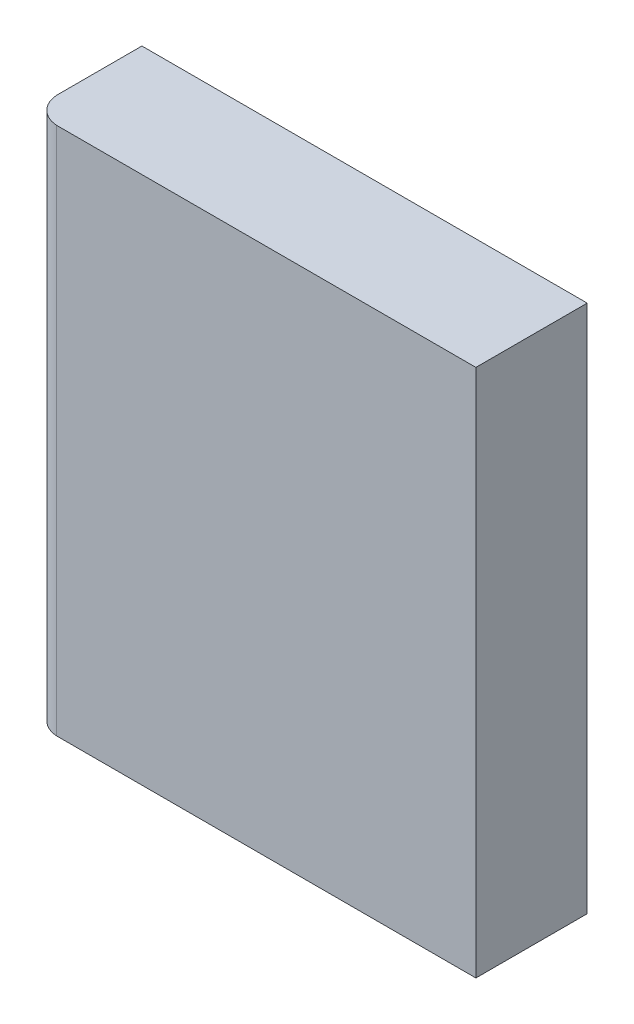
ISO-10303-21;
HEADER;
FILE_DESCRIPTION(('STEP AP214'),'2;1');
FILE_NAME('part.step','',(''),(''),'','','');
FILE_SCHEMA(('AUTOMOTIVE_DESIGN { 1 0 10303 214 1 1 1 1 }'));
ENDSEC;
DATA;
#1=APPLICATION_CONTEXT('core data for automotive mechanical design processes');
#2=APPLICATION_PROTOCOL_DEFINITION('international standard','automotive_design',2000,#1);
#3=PRODUCT_CONTEXT('',#1,'mechanical');
#4=PRODUCT('Part','Part','',(#3));
#5=PRODUCT_RELATED_PRODUCT_CATEGORY('part','',(#4));
#6=PRODUCT_DEFINITION_FORMATION('','',#4);
#7=PRODUCT_DEFINITION_CONTEXT('part definition',#1,'design');
#8=PRODUCT_DEFINITION('design','',#6,#7);
#9=PRODUCT_DEFINITION_SHAPE('','',#8);
#10=(LENGTH_UNIT() NAMED_UNIT(*) SI_UNIT(.MILLI.,.METRE.));
#11=(NAMED_UNIT(*) PLANE_ANGLE_UNIT() SI_UNIT($,.RADIAN.));
#12=(NAMED_UNIT(*) SI_UNIT($,.STERADIAN.) SOLID_ANGLE_UNIT());
#13=UNCERTAINTY_MEASURE_WITH_UNIT(LENGTH_MEASURE(1.E-05),#10,'distance_accuracy_value','');
#14=(GEOMETRIC_REPRESENTATION_CONTEXT(3) GLOBAL_UNCERTAINTY_ASSIGNED_CONTEXT((#13)) GLOBAL_UNIT_ASSIGNED_CONTEXT((#10,
#11,#12)) REPRESENTATION_CONTEXT('',''));
#15=CARTESIAN_POINT('',(0.,0.,0.));
#16=DIRECTION('',(0.,0.,1.));
#17=DIRECTION('',(1.,0.,0.));
#18=AXIS2_PLACEMENT_3D('',#15,#16,#17);
#19=CARTESIAN_POINT('',(-12.7633232342914,30.1625,-2.9228113537551));
#20=DIRECTION('',(1.,0.,0.));
#21=DIRECTION('',(0.,0.,-1.));
#22=AXIS2_PLACEMENT_3D('',#19,#20,#21);
#23=PLANE('',#22);
#24=DIRECTION('',(0.,0.,1.));
#25=VECTOR('',#24,1.);
#26=CARTESIAN_POINT('',(-12.7633232342914,0.,-2.9228113537551));
#27=LINE('',#26,#25);
#28=CARTESIAN_POINT('',(-12.7633232342914,0.,-2.9228113537551));
#29=VERTEX_POINT('',#28);
#30=CARTESIAN_POINT('',(-12.7633232342914,0.,1.92838620796249));
#31=VERTEX_POINT('',#30);
#32=EDGE_CURVE('E109',#29,#31,#27,.T.);
#33=ORIENTED_EDGE('',*,*,#32,.T.);
#34=DIRECTION('',(0.,-1.,0.));
#35=VECTOR('',#34,1.);
#36=CARTESIAN_POINT('',(-12.7633232342914,30.1625,1.92838620796249));
#37=LINE('',#36,#35);
#38=CARTESIAN_POINT('',(-12.7633232342914,30.1625,1.92838620796249));
#39=VERTEX_POINT('',#38);
#40=EDGE_CURVE('E11',#39,#31,#37,.T.);
#41=ORIENTED_EDGE('',*,*,#40,.F.);
#42=DIRECTION('',(0.,0.,1.));
#43=VECTOR('',#42,1.);
#44=CARTESIAN_POINT('',(-12.7633232342914,30.1625,-2.9228113537551));
#45=LINE('',#44,#43);
#46=CARTESIAN_POINT('',(-12.7633232342914,30.1625,-2.9228113537551));
#47=VERTEX_POINT('',#46);
#48=EDGE_CURVE('E117',#47,#39,#45,.T.);
#49=ORIENTED_EDGE('',*,*,#48,.F.);
#50=DIRECTION('',(0.,-1.,0.));
#51=VECTOR('',#50,1.);
#52=CARTESIAN_POINT('',(-12.7633232342914,30.1625,-2.9228113537551));
#53=LINE('',#52,#51);
#54=EDGE_CURVE('E105',#47,#29,#53,.T.);
#55=ORIENTED_EDGE('',*,*,#54,.T.);
#56=EDGE_LOOP('',(#33,#41,#49,#55));
#57=FACE_BOUND('',#56,.T.);
#58=ADVANCED_FACE('F35',(#57),#23,.F.);
#59=CARTESIAN_POINT('',(-11.1781219985274,30.1625,1.84298543435758));
#60=DIRECTION('',(0.,-1.,0.));
#61=DIRECTION('',(0.,0.,-1.));
#62=AXIS2_PLACEMENT_3D('',#59,#60,#61);
#63=CYLINDRICAL_SURFACE('',#62,1.5875);
#64=CARTESIAN_POINT('',(-11.1781219985274,0.,1.84298543435758));
#65=DIRECTION('',(0.,1.,0.));
#66=DIRECTION('',(0.,0.,1.));
#67=AXIS2_PLACEMENT_3D('',#64,#65,#66);
#68=CIRCLE('',#67,1.5875);
#69=CARTESIAN_POINT('',(-11.2803787021996,0.,3.4271886462449));
#70=VERTEX_POINT('',#69);
#71=EDGE_CURVE('E112',#31,#70,#68,.T.);
#72=ORIENTED_EDGE('',*,*,#71,.T.);
#73=DIRECTION('',(0.,-1.,0.));
#74=VECTOR('',#73,1.);
#75=CARTESIAN_POINT('',(-11.2803787021996,30.1625,3.4271886462449));
#76=LINE('',#75,#74);
#77=CARTESIAN_POINT('',(-11.2803787021996,30.1625,3.4271886462449));
#78=VERTEX_POINT('',#77);
#79=EDGE_CURVE('E43',#78,#70,#76,.T.);
#80=ORIENTED_EDGE('',*,*,#79,.F.);
#81=CARTESIAN_POINT('',(-11.1781219985274,30.1625,1.84298543435758));
#82=DIRECTION('',(0.,1.,0.));
#83=DIRECTION('',(0.,0.,1.));
#84=AXIS2_PLACEMENT_3D('',#81,#82,#83);
#85=CIRCLE('',#84,1.5875);
#86=EDGE_CURVE('E85',#39,#78,#85,.T.);
#87=ORIENTED_EDGE('',*,*,#86,.F.);
#88=ORIENTED_EDGE('',*,*,#40,.T.);
#89=EDGE_LOOP('',(#72,#80,#87,#88));
#90=FACE_BOUND('',#89,.T.);
#91=ADVANCED_FACE('F136',(#90),#63,.T.);
#92=CARTESIAN_POINT('',(-11.2803787021996,30.1625,3.4271886462449));
#93=DIRECTION('',(0.,0.,-1.));
#94=DIRECTION('',(-1.,0.,0.));
#95=AXIS2_PLACEMENT_3D('',#92,#93,#94);
#96=PLANE('',#95);
#97=DIRECTION('',(1.,0.,0.));
#98=VECTOR('',#97,1.);
#99=CARTESIAN_POINT('',(-11.2803787021996,0.,3.4271886462449));
#100=LINE('',#99,#98);
#101=CARTESIAN_POINT('',(12.6366767657087,0.,3.4271886462449));
#102=VERTEX_POINT('',#101);
#103=EDGE_CURVE('E100',#70,#102,#100,.T.);
#104=ORIENTED_EDGE('',*,*,#103,.T.);
#105=DIRECTION('',(0.,-1.,0.));
#106=VECTOR('',#105,1.);
#107=CARTESIAN_POINT('',(12.6366767657087,30.1625,3.4271886462449));
#108=LINE('',#107,#106);
#109=CARTESIAN_POINT('',(12.6366767657087,30.1625,3.4271886462449));
#110=VERTEX_POINT('',#109);
#111=EDGE_CURVE('E97',#110,#102,#108,.T.);
#112=ORIENTED_EDGE('',*,*,#111,.F.);
#113=DIRECTION('',(1.,0.,0.));
#114=VECTOR('',#113,1.);
#115=CARTESIAN_POINT('',(-11.2803787021996,30.1625,3.4271886462449));
#116=LINE('',#115,#114);
#117=EDGE_CURVE('E89',#78,#110,#116,.T.);
#118=ORIENTED_EDGE('',*,*,#117,.F.);
#119=ORIENTED_EDGE('',*,*,#79,.T.);
#120=EDGE_LOOP('',(#104,#112,#118,#119));
#121=FACE_BOUND('',#120,.T.);
#122=ADVANCED_FACE('F98',(#121),#96,.F.);
#123=CARTESIAN_POINT('',(12.6366767657087,30.1625,-2.9228113537551));
#124=DIRECTION('',(-1.,0.,0.));
#125=DIRECTION('',(0.,0.,1.));
#126=AXIS2_PLACEMENT_3D('',#123,#124,#125);
#127=PLANE('',#126);
#128=DIRECTION('',(0.,0.,-1.));
#129=VECTOR('',#128,1.);
#130=CARTESIAN_POINT('',(12.6366767657087,0.,-2.9228113537551));
#131=LINE('',#130,#129);
#132=CARTESIAN_POINT('',(12.6366767657087,0.,-2.9228113537551));
#133=VERTEX_POINT('',#132);
#134=EDGE_CURVE('E71',#102,#133,#131,.T.);
#135=ORIENTED_EDGE('',*,*,#134,.T.);
#136=DIRECTION('',(0.,-1.,0.));
#137=VECTOR('',#136,1.);
#138=CARTESIAN_POINT('',(12.6366767657087,30.1625,-2.9228113537551));
#139=LINE('',#138,#137);
#140=CARTESIAN_POINT('',(12.6366767657087,30.1625,-2.9228113537551));
#141=VERTEX_POINT('',#140);
#142=EDGE_CURVE('E101',#141,#133,#139,.T.);
#143=ORIENTED_EDGE('',*,*,#142,.F.);
#144=DIRECTION('',(0.,0.,-1.));
#145=VECTOR('',#144,1.);
#146=CARTESIAN_POINT('',(12.6366767657087,30.1625,-2.9228113537551));
#147=LINE('',#146,#145);
#148=EDGE_CURVE('E93',#110,#141,#147,.T.);
#149=ORIENTED_EDGE('',*,*,#148,.F.);
#150=ORIENTED_EDGE('',*,*,#111,.T.);
#151=EDGE_LOOP('',(#135,#143,#149,#150));
#152=FACE_BOUND('',#151,.T.);
#153=ADVANCED_FACE('F103',(#152),#127,.F.);
#154=CARTESIAN_POINT('',(-12.7633232342914,30.1625,-2.9228113537551));
#155=DIRECTION('',(0.,0.,1.));
#156=DIRECTION('',(1.,0.,0.));
#157=AXIS2_PLACEMENT_3D('',#154,#155,#156);
#158=PLANE('',#157);
#159=DIRECTION('',(-1.,0.,0.));
#160=VECTOR('',#159,1.);
#161=CARTESIAN_POINT('',(-12.7633232342914,0.,-2.9228113537551));
#162=LINE('',#161,#160);
#163=EDGE_CURVE('E77',#133,#29,#162,.T.);
#164=ORIENTED_EDGE('',*,*,#163,.T.);
#165=ORIENTED_EDGE('',*,*,#54,.F.);
#166=DIRECTION('',(-1.,0.,0.));
#167=VECTOR('',#166,1.);
#168=CARTESIAN_POINT('',(-12.7633232342914,30.1625,-2.9228113537551));
#169=LINE('',#168,#167);
#170=EDGE_CURVE('E51',#141,#47,#169,.T.);
#171=ORIENTED_EDGE('',*,*,#170,.F.);
#172=ORIENTED_EDGE('',*,*,#142,.T.);
#173=EDGE_LOOP('',(#164,#165,#171,#172));
#174=FACE_BOUND('',#173,.T.);
#175=ADVANCED_FACE('F125',(#174),#158,.F.);
#176=CARTESIAN_POINT('',(-11.1781219985274,30.1625,1.84298543435758));
#177=DIRECTION('',(0.,1.,0.));
#178=DIRECTION('',(0.,0.,1.));
#179=AXIS2_PLACEMENT_3D('',#176,#177,#178);
#180=PLANE('',#179);
#181=ORIENTED_EDGE('',*,*,#48,.T.);
#182=ORIENTED_EDGE('',*,*,#86,.T.);
#183=ORIENTED_EDGE('',*,*,#117,.T.);
#184=ORIENTED_EDGE('',*,*,#148,.T.);
#185=ORIENTED_EDGE('',*,*,#170,.T.);
#186=EDGE_LOOP('',(#181,#182,#183,#184,#185));
#187=FACE_BOUND('',#186,.T.);
#188=ADVANCED_FACE('F91',(#187),#180,.T.);
#189=CARTESIAN_POINT('',(-11.1781219985274,0.,1.84298543435758));
#190=DIRECTION('',(0.,1.,0.));
#191=DIRECTION('',(0.,0.,1.));
#192=AXIS2_PLACEMENT_3D('',#189,#190,#191);
#193=PLANE('',#192);
#194=ORIENTED_EDGE('',*,*,#32,.F.);
#195=ORIENTED_EDGE('',*,*,#163,.F.);
#196=ORIENTED_EDGE('',*,*,#134,.F.);
#197=ORIENTED_EDGE('',*,*,#103,.F.);
#198=ORIENTED_EDGE('',*,*,#71,.F.);
#199=EDGE_LOOP('',(#194,#195,#196,#197,#198));
#200=FACE_BOUND('',#199,.T.);
#201=ADVANCED_FACE('F121',(#200),#193,.F.);
#202=CLOSED_SHELL('',(#58,#91,#122,#153,#175,#188,#201));
#203=MANIFOLD_SOLID_BREP('B2',#202);
#204=ADVANCED_BREP_SHAPE_REPRESENTATION('',(#18,#203),#14);
#205=SHAPE_DEFINITION_REPRESENTATION(#9,#204);
ENDSEC;
END-ISO-10303-21;
